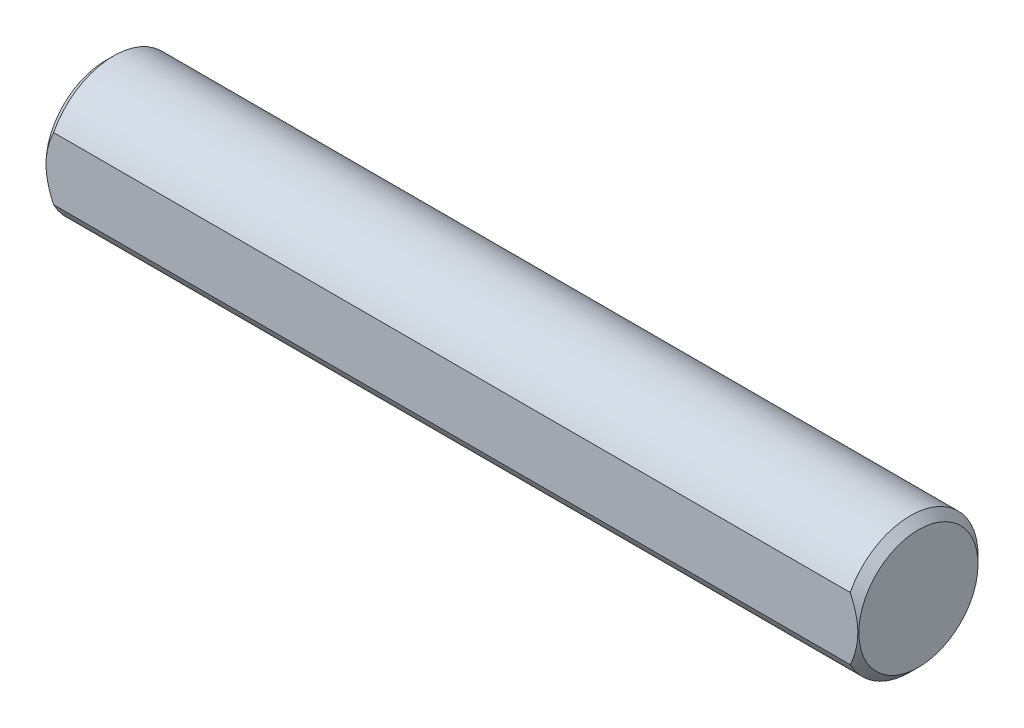
ISO-10303-21;
HEADER;
FILE_DESCRIPTION(('STEP AP214'),'2;1');
FILE_NAME('part.step','',(''),(''),'','','');
FILE_SCHEMA(('AUTOMOTIVE_DESIGN { 1 0 10303 214 1 1 1 1 }'));
ENDSEC;
DATA;
#1=APPLICATION_CONTEXT('core data for automotive mechanical design processes');
#2=APPLICATION_PROTOCOL_DEFINITION('international standard','automotive_design',2000,#1);
#3=PRODUCT_CONTEXT('',#1,'mechanical');
#4=PRODUCT('Part','Part','',(#3));
#5=PRODUCT_RELATED_PRODUCT_CATEGORY('part','',(#4));
#6=PRODUCT_DEFINITION_FORMATION('','',#4);
#7=PRODUCT_DEFINITION_CONTEXT('part definition',#1,'design');
#8=PRODUCT_DEFINITION('design','',#6,#7);
#9=PRODUCT_DEFINITION_SHAPE('','',#8);
#10=(LENGTH_UNIT() NAMED_UNIT(*) SI_UNIT(.MILLI.,.METRE.));
#11=(NAMED_UNIT(*) PLANE_ANGLE_UNIT() SI_UNIT($,.RADIAN.));
#12=(NAMED_UNIT(*) SI_UNIT($,.STERADIAN.) SOLID_ANGLE_UNIT());
#13=UNCERTAINTY_MEASURE_WITH_UNIT(LENGTH_MEASURE(1.E-05),#10,'distance_accuracy_value','');
#14=(GEOMETRIC_REPRESENTATION_CONTEXT(3) GLOBAL_UNCERTAINTY_ASSIGNED_CONTEXT((#13)) GLOBAL_UNIT_ASSIGNED_CONTEXT((#10,
#11,#12)) REPRESENTATION_CONTEXT('',''));
#15=CARTESIAN_POINT('',(0.,0.,0.));
#16=DIRECTION('',(0.,0.,1.));
#17=DIRECTION('',(1.,0.,0.));
#18=AXIS2_PLACEMENT_3D('',#15,#16,#17);
#19=CARTESIAN_POINT('',(18.3,1.20974832423681,2.));
#20=DIRECTION('',(0.,0.,-1.));
#21=DIRECTION('',(0.,-1.,0.));
#22=AXIS2_PLACEMENT_3D('',#19,#20,#21);
#23=PLANE('',#22);
#24=CARTESIAN_POINT('',(-11.4000000000021,1.20974832423214,2.));
#25=CARTESIAN_POINT('',(-11.6513129894097,0.665245355973013,2.));
#26=CARTESIAN_POINT('',(-11.7126802795716,-0.420516692557048,2.));
#27=CARTESIAN_POINT('',(-11.4000000000007,-1.09798004510196,2.));
#28=(BOUNDED_CURVE() B_SPLINE_CURVE(2,(#24,#25,#26,#27),.UNSPECIFIED.,.F.,
.F.) B_SPLINE_CURVE_WITH_KNOTS((3,1,3),(3.35099956469465,4.40031959946099,5.72405715928),
.UNSPECIFIED.) CURVE() GEOMETRIC_REPRESENTATION_ITEM() RATIONAL_B_SPLINE_CURVE((7.51008535283671,
7.93265139846925,8.04316060878708,7.51008535283441)) REPRESENTATION_ITEM(''));
#29=CARTESIAN_POINT('',(-11.4,1.20974832423681,2.));
#30=VERTEX_POINT('',#29);
#31=CARTESIAN_POINT('',(-11.4,-1.09798004510351,2.));
#32=VERTEX_POINT('',#31);
#33=EDGE_CURVE('E104',#30,#32,#28,.T.);
#34=ORIENTED_EDGE('',*,*,#33,.T.);
#35=DIRECTION('',(-1.,0.,0.));
#36=VECTOR('',#35,1.);
#37=CARTESIAN_POINT('',(18.3,-1.0979800451035,2.));
#38=LINE('',#37,#36);
#39=CARTESIAN_POINT('',(18.,-1.0979800451035,2.));
#40=VERTEX_POINT('',#39);
#41=EDGE_CURVE('E27',#40,#32,#38,.T.);
#42=ORIENTED_EDGE('',*,*,#41,.F.);
#43=CARTESIAN_POINT('',(18.0000000000021,-1.0979800450989,2.));
#44=CARTESIAN_POINT('',(18.2507550527183,-0.554685920780799,2.));
#45=CARTESIAN_POINT('',(18.3132228553944,0.531109409111279,2.));
#46=CARTESIAN_POINT('',(18.0000000000007,1.20974832423529,2.));
#47=(BOUNDED_CURVE() B_SPLINE_CURVE(2,(#43,#44,#45,#46),.UNSPECIFIED.,.F.,
.F.) B_SPLINE_CURVE_WITH_KNOTS((3,1,3),(3.34768999622063,4.39360439053465,5.71860477780419),
.UNSPECIFIED.) CURVE() GEOMETRIC_REPRESENTATION_ITEM() RATIONAL_B_SPLINE_CURVE((7.50352302993382,
7.9247299074711,8.03712241329683,7.50352302993157)) REPRESENTATION_ITEM(''));
#48=CARTESIAN_POINT('',(18.,1.20974832423681,2.));
#49=VERTEX_POINT('',#48);
#50=EDGE_CURVE('E93',#40,#49,#47,.T.);
#51=ORIENTED_EDGE('',*,*,#50,.T.);
#52=DIRECTION('',(-1.,0.,0.));
#53=VECTOR('',#52,1.);
#54=CARTESIAN_POINT('',(18.3,1.20974832423681,2.));
#55=LINE('',#54,#53);
#56=EDGE_CURVE('E11',#49,#30,#55,.T.);
#57=ORIENTED_EDGE('',*,*,#56,.T.);
#58=EDGE_LOOP('',(#34,#42,#51,#57));
#59=FACE_BOUND('',#58,.T.);
#60=ADVANCED_FACE('F17',(#59),#23,.F.);
#61=CARTESIAN_POINT('',(-11.7,0.055884139566651,-0.217791118057666));
#62=DIRECTION('',(1.,0.,0.));
#63=DIRECTION('',(0.,1.,0.));
#64=AXIS2_PLACEMENT_3D('',#61,#62,#63);
#65=PLANE('',#64);
#66=CARTESIAN_POINT('',(-11.7,0.055884139566651,-0.217791118057666));
#67=DIRECTION('',(-1.,0.,0.));
#68=DIRECTION('',(0.,1.,0.));
#69=AXIS2_PLACEMENT_3D('',#66,#67,#68);
#70=CIRCLE('',#69,2.2);
#71=CARTESIAN_POINT('',(-11.7,-2.14411586043335,-0.217791118057666));
#72=VERTEX_POINT('',#71);
#73=EDGE_CURVE('E39',#72,#72,#70,.T.);
#74=ORIENTED_EDGE('',*,*,#73,.T.);
#75=EDGE_LOOP('',(#74));
#76=FACE_BOUND('',#75,.T.);
#77=ADVANCED_FACE('F142',(#76),#65,.F.);
#78=CARTESIAN_POINT('',(18.3,0.0558841395666549,-0.217791118057666));
#79=DIRECTION('',(1.,0.,0.));
#80=DIRECTION('',(0.,1.,0.));
#81=AXIS2_PLACEMENT_3D('',#78,#79,#80);
#82=PLANE('',#81);
#83=CARTESIAN_POINT('',(18.3,0.0558841395666549,-0.217791118057666));
#84=DIRECTION('',(1.,0.,0.));
#85=DIRECTION('',(0.,1.,0.));
#86=AXIS2_PLACEMENT_3D('',#83,#84,#85);
#87=CIRCLE('',#86,2.2);
#88=CARTESIAN_POINT('',(18.3,2.25588413956666,-0.217791118057666));
#89=VERTEX_POINT('',#88);
#90=EDGE_CURVE('E20',#89,#89,#87,.T.);
#91=ORIENTED_EDGE('',*,*,#90,.T.);
#92=EDGE_LOOP('',(#91));
#93=FACE_BOUND('',#92,.T.);
#94=ADVANCED_FACE('F138',(#93),#82,.T.);
#95=CARTESIAN_POINT('',(22.3,0.0558841395666549,-0.217791118057666));
#96=DIRECTION('',(-1.,0.,0.));
#97=DIRECTION('',(0.,0.,-1.));
#98=AXIS2_PLACEMENT_3D('',#95,#96,#97);
#99=CYLINDRICAL_SURFACE('',#98,2.5);
#100=CARTESIAN_POINT('',(18.,0.0558841395666549,-0.217791118057666));
#101=DIRECTION('',(-1.,0.,0.));
#102=DIRECTION('',(0.,1.,0.));
#103=AXIS2_PLACEMENT_3D('',#100,#101,#102);
#104=CIRCLE('',#103,2.5);
#105=CARTESIAN_POINT('',(18.,2.55588413956665,-0.217791118057666));
#106=VERTEX_POINT('',#105);
#107=EDGE_CURVE('E88',#49,#106,#104,.T.);
#108=ORIENTED_EDGE('',*,*,#107,.T.);
#109=CARTESIAN_POINT('',(18.,0.0558841395666549,-0.217791118057666));
#110=DIRECTION('',(-1.,0.,0.));
#111=DIRECTION('',(0.,1.,0.));
#112=AXIS2_PLACEMENT_3D('',#109,#110,#111);
#113=CIRCLE('',#112,2.5);
#114=EDGE_CURVE('E95',#106,#40,#113,.T.);
#115=ORIENTED_EDGE('',*,*,#114,.T.);
#116=ORIENTED_EDGE('',*,*,#41,.T.);
#117=CARTESIAN_POINT('',(-11.4,0.0558841395666511,-0.217791118057666));
#118=DIRECTION('',(1.,0.,0.));
#119=DIRECTION('',(0.,1.,0.));
#120=AXIS2_PLACEMENT_3D('',#117,#118,#119);
#121=CIRCLE('',#120,2.5);
#122=CARTESIAN_POINT('',(-11.4,-2.44411586043335,-0.217791118057666));
#123=VERTEX_POINT('',#122);
#124=EDGE_CURVE('E107',#32,#123,#121,.T.);
#125=ORIENTED_EDGE('',*,*,#124,.T.);
#126=CARTESIAN_POINT('',(-11.4,0.0558841395666511,-0.217791118057666));
#127=DIRECTION('',(1.,0.,0.));
#128=DIRECTION('',(0.,1.,0.));
#129=AXIS2_PLACEMENT_3D('',#126,#127,#128);
#130=CIRCLE('',#129,2.5);
#131=EDGE_CURVE('E89',#123,#30,#130,.T.);
#132=ORIENTED_EDGE('',*,*,#131,.T.);
#133=ORIENTED_EDGE('',*,*,#56,.F.);
#134=EDGE_LOOP('',(#108,#115,#116,#125,#132,#133));
#135=FACE_BOUND('',#134,.T.);
#136=ADVANCED_FACE('F87',(#135),#99,.T.);
#137=CARTESIAN_POINT('',(-11.4,0.0558841395666511,-0.217791118057666));
#138=DIRECTION('',(1.,0.,0.));
#139=DIRECTION('',(0.,1.,0.));
#140=AXIS2_PLACEMENT_3D('',#137,#138,#139);
#141=CONICAL_SURFACE('',#140,2.5,0.785398163397446);
#142=ORIENTED_EDGE('',*,*,#124,.F.);
#143=ORIENTED_EDGE('',*,*,#33,.F.);
#144=ORIENTED_EDGE('',*,*,#131,.F.);
#145=DIRECTION('',(-0.70710678118655,0.707106781186546,0.));
#146=VECTOR('',#145,1.);
#147=CARTESIAN_POINT('',(-11.4,-2.44411586043335,-0.217791118057666));
#148=LINE('',#147,#146);
#149=EDGE_CURVE('E51',#123,#72,#148,.T.);
#150=ORIENTED_EDGE('',*,*,#149,.T.);
#151=ORIENTED_EDGE('',*,*,#73,.F.);
#152=ORIENTED_EDGE('',*,*,#149,.F.);
#153=EDGE_LOOP('',(#142,#143,#144,#150,#151,#152));
#154=FACE_BOUND('',#153,.T.);
#155=ADVANCED_FACE('F130',(#154),#141,.T.);
#156=CARTESIAN_POINT('',(18.3,0.0558841395666549,-0.217791118057666));
#157=DIRECTION('',(-1.,0.,0.));
#158=DIRECTION('',(0.,-1.,0.));
#159=AXIS2_PLACEMENT_3D('',#156,#157,#158);
#160=CONICAL_SURFACE('',#159,2.2,0.785398163397446);
#161=ORIENTED_EDGE('',*,*,#107,.F.);
#162=ORIENTED_EDGE('',*,*,#50,.F.);
#163=ORIENTED_EDGE('',*,*,#114,.F.);
#164=DIRECTION('',(0.70710678118655,-0.707106781186546,0.));
#165=VECTOR('',#164,1.);
#166=CARTESIAN_POINT('',(18.3,2.25588413956666,-0.217791118057666));
#167=LINE('',#166,#165);
#168=EDGE_CURVE('E80',#106,#89,#167,.T.);
#169=ORIENTED_EDGE('',*,*,#168,.T.);
#170=ORIENTED_EDGE('',*,*,#90,.F.);
#171=ORIENTED_EDGE('',*,*,#168,.F.);
#172=EDGE_LOOP('',(#161,#162,#163,#169,#170,#171));
#173=FACE_BOUND('',#172,.T.);
#174=ADVANCED_FACE('F97',(#173),#160,.T.);
#175=CLOSED_SHELL('',(#60,#77,#94,#136,#155,#174));
#176=MANIFOLD_SOLID_BREP('B1',#175);
#177=ADVANCED_BREP_SHAPE_REPRESENTATION('',(#18,#176),#14);
#178=SHAPE_DEFINITION_REPRESENTATION(#9,#177);
ENDSEC;
END-ISO-10303-21;
